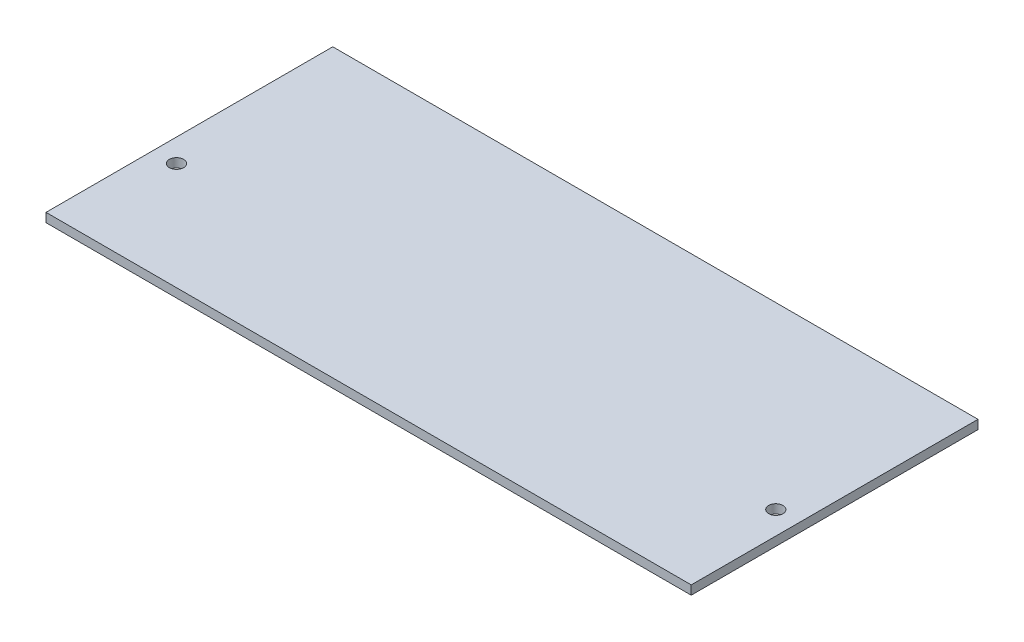
ISO-10303-21;
HEADER;
FILE_DESCRIPTION(('STEP AP214'),'2;1');
FILE_NAME('part.step','',(''),(''),'','','');
FILE_SCHEMA(('AUTOMOTIVE_DESIGN { 1 0 10303 214 1 1 1 1 }'));
ENDSEC;
DATA;
#1=APPLICATION_CONTEXT('core data for automotive mechanical design processes');
#2=APPLICATION_PROTOCOL_DEFINITION('international standard','automotive_design',2000,#1);
#3=PRODUCT_CONTEXT('',#1,'mechanical');
#4=PRODUCT('Part','Part','',(#3));
#5=PRODUCT_RELATED_PRODUCT_CATEGORY('part','',(#4));
#6=PRODUCT_DEFINITION_FORMATION('','',#4);
#7=PRODUCT_DEFINITION_CONTEXT('part definition',#1,'design');
#8=PRODUCT_DEFINITION('design','',#6,#7);
#9=PRODUCT_DEFINITION_SHAPE('','',#8);
#10=(LENGTH_UNIT() NAMED_UNIT(*) SI_UNIT(.MILLI.,.METRE.));
#11=(NAMED_UNIT(*) PLANE_ANGLE_UNIT() SI_UNIT($,.RADIAN.));
#12=(NAMED_UNIT(*) SI_UNIT($,.STERADIAN.) SOLID_ANGLE_UNIT());
#13=UNCERTAINTY_MEASURE_WITH_UNIT(LENGTH_MEASURE(1.E-05),#10,'distance_accuracy_value','');
#14=(GEOMETRIC_REPRESENTATION_CONTEXT(3) GLOBAL_UNCERTAINTY_ASSIGNED_CONTEXT((#13)) GLOBAL_UNIT_ASSIGNED_CONTEXT((#10,
#11,#12)) REPRESENTATION_CONTEXT('',''));
#15=CARTESIAN_POINT('',(0.,0.,0.));
#16=DIRECTION('',(0.,0.,1.));
#17=DIRECTION('',(1.,0.,0.));
#18=AXIS2_PLACEMENT_3D('',#15,#16,#17);
#19=CARTESIAN_POINT('',(-39.2903543204284,3.175,-44.3075964998153));
#20=DIRECTION('',(1.,0.,0.));
#21=DIRECTION('',(0.,0.,-1.));
#22=AXIS2_PLACEMENT_3D('',#19,#20,#21);
#23=PLANE('',#22);
#24=DIRECTION('',(0.,0.,1.));
#25=VECTOR('',#24,1.);
#26=CARTESIAN_POINT('',(-39.2903543204284,0.,-44.3075964998153));
#27=LINE('',#26,#25);
#28=CARTESIAN_POINT('',(-39.2903543204284,0.,-44.3075964998153));
#29=VERTEX_POINT('',#28);
#30=CARTESIAN_POINT('',(-39.2903543204284,0.,57.2924035001847));
#31=VERTEX_POINT('',#30);
#32=EDGE_CURVE('E96',#29,#31,#27,.T.);
#33=ORIENTED_EDGE('',*,*,#32,.T.);
#34=DIRECTION('',(0.,-1.,0.));
#35=VECTOR('',#34,1.);
#36=CARTESIAN_POINT('',(-39.2903543204284,3.175,57.2924035001847));
#37=LINE('',#36,#35);
#38=CARTESIAN_POINT('',(-39.2903543204284,3.175,57.2924035001847));
#39=VERTEX_POINT('',#38);
#40=EDGE_CURVE('E11',#39,#31,#37,.T.);
#41=ORIENTED_EDGE('',*,*,#40,.F.);
#42=DIRECTION('',(0.,0.,1.));
#43=VECTOR('',#42,1.);
#44=CARTESIAN_POINT('',(-39.2903543204284,3.175,-44.3075964998153));
#45=LINE('',#44,#43);
#46=CARTESIAN_POINT('',(-39.2903543204284,3.175,-44.3075964998153));
#47=VERTEX_POINT('',#46);
#48=EDGE_CURVE('E84',#47,#39,#45,.T.);
#49=ORIENTED_EDGE('',*,*,#48,.F.);
#50=DIRECTION('',(0.,-1.,0.));
#51=VECTOR('',#50,1.);
#52=CARTESIAN_POINT('',(-39.2903543204284,3.175,-44.3075964998153));
#53=LINE('',#52,#51);
#54=EDGE_CURVE('E92',#47,#29,#53,.T.);
#55=ORIENTED_EDGE('',*,*,#54,.T.);
#56=EDGE_LOOP('',(#33,#41,#49,#55));
#57=FACE_BOUND('',#56,.T.);
#58=ADVANCED_FACE('F33',(#57),#23,.F.);
#59=CARTESIAN_POINT('',(-39.2903543204284,3.175,57.2924035001847));
#60=DIRECTION('',(0.,0.,-1.));
#61=DIRECTION('',(-1.,0.,0.));
#62=AXIS2_PLACEMENT_3D('',#59,#60,#61);
#63=PLANE('',#62);
#64=DIRECTION('',(1.,0.,0.));
#65=VECTOR('',#64,1.);
#66=CARTESIAN_POINT('',(-39.2903543204284,0.,57.2924035001847));
#67=LINE('',#66,#65);
#68=CARTESIAN_POINT('',(189.309645679572,0.,57.2924035001847));
#69=VERTEX_POINT('',#68);
#70=EDGE_CURVE('E88',#31,#69,#67,.T.);
#71=ORIENTED_EDGE('',*,*,#70,.T.);
#72=DIRECTION('',(0.,-1.,0.));
#73=VECTOR('',#72,1.);
#74=CARTESIAN_POINT('',(189.309645679572,3.175,57.2924035001847));
#75=LINE('',#74,#73);
#76=CARTESIAN_POINT('',(189.309645679572,3.175,57.2924035001847));
#77=VERTEX_POINT('',#76);
#78=EDGE_CURVE('E41',#77,#69,#75,.T.);
#79=ORIENTED_EDGE('',*,*,#78,.F.);
#80=DIRECTION('',(1.,0.,0.));
#81=VECTOR('',#80,1.);
#82=CARTESIAN_POINT('',(-39.2903543204284,3.175,57.2924035001847));
#83=LINE('',#82,#81);
#84=EDGE_CURVE('E79',#39,#77,#83,.T.);
#85=ORIENTED_EDGE('',*,*,#84,.F.);
#86=ORIENTED_EDGE('',*,*,#40,.T.);
#87=EDGE_LOOP('',(#71,#79,#85,#86));
#88=FACE_BOUND('',#87,.T.);
#89=ADVANCED_FACE('F87',(#88),#63,.F.);
#90=CARTESIAN_POINT('',(189.309645679572,3.175,-44.3075964998153));
#91=DIRECTION('',(-1.,0.,0.));
#92=DIRECTION('',(0.,0.,1.));
#93=AXIS2_PLACEMENT_3D('',#90,#91,#92);
#94=PLANE('',#93);
#95=DIRECTION('',(0.,0.,-1.));
#96=VECTOR('',#95,1.);
#97=CARTESIAN_POINT('',(189.309645679572,0.,-44.3075964998153));
#98=LINE('',#97,#96);
#99=CARTESIAN_POINT('',(189.309645679572,0.,-44.3075964998153));
#100=VERTEX_POINT('',#99);
#101=EDGE_CURVE('E66',#69,#100,#98,.T.);
#102=ORIENTED_EDGE('',*,*,#101,.T.);
#103=DIRECTION('',(0.,-1.,0.));
#104=VECTOR('',#103,1.);
#105=CARTESIAN_POINT('',(189.309645679572,3.175,-44.3075964998153));
#106=LINE('',#105,#104);
#107=CARTESIAN_POINT('',(189.309645679572,3.175,-44.3075964998153));
#108=VERTEX_POINT('',#107);
#109=EDGE_CURVE('E89',#108,#100,#106,.T.);
#110=ORIENTED_EDGE('',*,*,#109,.F.);
#111=DIRECTION('',(0.,0.,-1.));
#112=VECTOR('',#111,1.);
#113=CARTESIAN_POINT('',(189.309645679572,3.175,-44.3075964998153));
#114=LINE('',#113,#112);
#115=EDGE_CURVE('E82',#77,#108,#114,.T.);
#116=ORIENTED_EDGE('',*,*,#115,.F.);
#117=ORIENTED_EDGE('',*,*,#78,.T.);
#118=EDGE_LOOP('',(#102,#110,#116,#117));
#119=FACE_BOUND('',#118,.T.);
#120=ADVANCED_FACE('F90',(#119),#94,.F.);
#121=CARTESIAN_POINT('',(-39.2903543204284,3.175,-44.3075964998153));
#122=DIRECTION('',(0.,0.,1.));
#123=DIRECTION('',(1.,0.,0.));
#124=AXIS2_PLACEMENT_3D('',#121,#122,#123);
#125=PLANE('',#124);
#126=DIRECTION('',(-1.,0.,0.));
#127=VECTOR('',#126,1.);
#128=CARTESIAN_POINT('',(-39.2903543204284,0.,-44.3075964998153));
#129=LINE('',#128,#127);
#130=EDGE_CURVE('E72',#100,#29,#129,.T.);
#131=ORIENTED_EDGE('',*,*,#130,.T.);
#132=ORIENTED_EDGE('',*,*,#54,.F.);
#133=DIRECTION('',(-1.,0.,0.));
#134=VECTOR('',#133,1.);
#135=CARTESIAN_POINT('',(-39.2903543204284,3.175,-44.3075964998153));
#136=LINE('',#135,#134);
#137=EDGE_CURVE('E49',#108,#47,#136,.T.);
#138=ORIENTED_EDGE('',*,*,#137,.F.);
#139=ORIENTED_EDGE('',*,*,#109,.T.);
#140=EDGE_LOOP('',(#131,#132,#138,#139));
#141=FACE_BOUND('',#140,.T.);
#142=ADVANCED_FACE('F104',(#141),#125,.F.);
#143=CARTESIAN_POINT('',(0.,3.175,0.));
#144=DIRECTION('',(0.,1.,0.));
#145=DIRECTION('',(0.,0.,1.));
#146=AXIS2_PLACEMENT_3D('',#143,#144,#145);
#147=PLANE('',#146);
#148=CARTESIAN_POINT('',(181.181645679572,3.175,19.1924035001847));
#149=DIRECTION('',(0.,-1.,0.));
#150=DIRECTION('',(0.,0.,-1.));
#151=AXIS2_PLACEMENT_3D('',#148,#149,#150);
#152=CIRCLE('',#151,2.54000000000001);
#153=CARTESIAN_POINT('',(181.181645679572,3.175,16.6524035001847));
#154=VERTEX_POINT('',#153);
#155=EDGE_CURVE('E113',#154,#154,#152,.T.);
#156=ORIENTED_EDGE('',*,*,#155,.T.);
#157=EDGE_LOOP('',(#156));
#158=FACE_BOUND('',#157,.T.);
#159=CARTESIAN_POINT('',(-31.1623543204284,3.175,19.1924035001847));
#160=DIRECTION('',(0.,-1.,0.));
#161=DIRECTION('',(0.,0.,-1.));
#162=AXIS2_PLACEMENT_3D('',#159,#160,#161);
#163=CIRCLE('',#162,2.54);
#164=CARTESIAN_POINT('',(-31.1623543204284,3.175,16.6524035001847));
#165=VERTEX_POINT('',#164);
#166=EDGE_CURVE('E99',#165,#165,#163,.T.);
#167=ORIENTED_EDGE('',*,*,#166,.T.);
#168=EDGE_LOOP('',(#167));
#169=FACE_BOUND('',#168,.T.);
#170=ORIENTED_EDGE('',*,*,#48,.T.);
#171=ORIENTED_EDGE('',*,*,#84,.T.);
#172=ORIENTED_EDGE('',*,*,#115,.T.);
#173=ORIENTED_EDGE('',*,*,#137,.T.);
#174=EDGE_LOOP('',(#170,#171,#172,#173));
#175=FACE_BOUND('',#174,.T.);
#176=ADVANCED_FACE('F80',(#158,#169,#175),#147,.T.);
#177=CARTESIAN_POINT('',(0.,0.,0.));
#178=DIRECTION('',(0.,1.,0.));
#179=DIRECTION('',(0.,0.,1.));
#180=AXIS2_PLACEMENT_3D('',#177,#178,#179);
#181=PLANE('',#180);
#182=CARTESIAN_POINT('',(181.181645679572,0.,19.1924035001847));
#183=DIRECTION('',(0.,-1.,0.));
#184=DIRECTION('',(0.,0.,-1.));
#185=AXIS2_PLACEMENT_3D('',#182,#183,#184);
#186=CIRCLE('',#185,2.54000000000001);
#187=CARTESIAN_POINT('',(181.181645679572,0.,16.6524035001847));
#188=VERTEX_POINT('',#187);
#189=EDGE_CURVE('E116',#188,#188,#186,.T.);
#190=ORIENTED_EDGE('',*,*,#189,.F.);
#191=EDGE_LOOP('',(#190));
#192=FACE_BOUND('',#191,.T.);
#193=CARTESIAN_POINT('',(-31.1623543204284,0.,19.1924035001847));
#194=DIRECTION('',(0.,-1.,0.));
#195=DIRECTION('',(0.,0.,-1.));
#196=AXIS2_PLACEMENT_3D('',#193,#194,#195);
#197=CIRCLE('',#196,2.54);
#198=CARTESIAN_POINT('',(-31.1623543204284,0.,16.6524035001847));
#199=VERTEX_POINT('',#198);
#200=EDGE_CURVE('E110',#199,#199,#197,.T.);
#201=ORIENTED_EDGE('',*,*,#200,.F.);
#202=EDGE_LOOP('',(#201));
#203=FACE_BOUND('',#202,.T.);
#204=ORIENTED_EDGE('',*,*,#32,.F.);
#205=ORIENTED_EDGE('',*,*,#130,.F.);
#206=ORIENTED_EDGE('',*,*,#101,.F.);
#207=ORIENTED_EDGE('',*,*,#70,.F.);
#208=EDGE_LOOP('',(#204,#205,#206,#207));
#209=FACE_BOUND('',#208,.T.);
#210=ADVANCED_FACE('F107',(#192,#203,#209),#181,.F.);
#211=CARTESIAN_POINT('',(-31.1623543204284,3.175,19.1924035001847));
#212=DIRECTION('',(0.,-1.,0.));
#213=DIRECTION('',(0.,0.,-1.));
#214=AXIS2_PLACEMENT_3D('',#211,#212,#213);
#215=CYLINDRICAL_SURFACE('',#214,2.54);
#216=ORIENTED_EDGE('',*,*,#166,.F.);
#217=EDGE_LOOP('',(#216));
#218=FACE_BOUND('',#217,.T.);
#219=ORIENTED_EDGE('',*,*,#200,.T.);
#220=EDGE_LOOP('',(#219));
#221=FACE_BOUND('',#220,.T.);
#222=ADVANCED_FACE('F127',(#218,#221),#215,.F.);
#223=CARTESIAN_POINT('',(181.181645679572,3.175,19.1924035001847));
#224=DIRECTION('',(0.,-1.,0.));
#225=DIRECTION('',(0.,0.,-1.));
#226=AXIS2_PLACEMENT_3D('',#223,#224,#225);
#227=CYLINDRICAL_SURFACE('',#226,2.54000000000001);
#228=ORIENTED_EDGE('',*,*,#155,.F.);
#229=EDGE_LOOP('',(#228));
#230=FACE_BOUND('',#229,.T.);
#231=ORIENTED_EDGE('',*,*,#189,.T.);
#232=EDGE_LOOP('',(#231));
#233=FACE_BOUND('',#232,.T.);
#234=ADVANCED_FACE('F124',(#230,#233),#227,.F.);
#235=CLOSED_SHELL('',(#58,#89,#120,#142,#176,#210,#222,#234));
#236=MANIFOLD_SOLID_BREP('B2',#235);
#237=ADVANCED_BREP_SHAPE_REPRESENTATION('',(#18,#236),#14);
#238=SHAPE_DEFINITION_REPRESENTATION(#9,#237);
ENDSEC;
END-ISO-10303-21;
